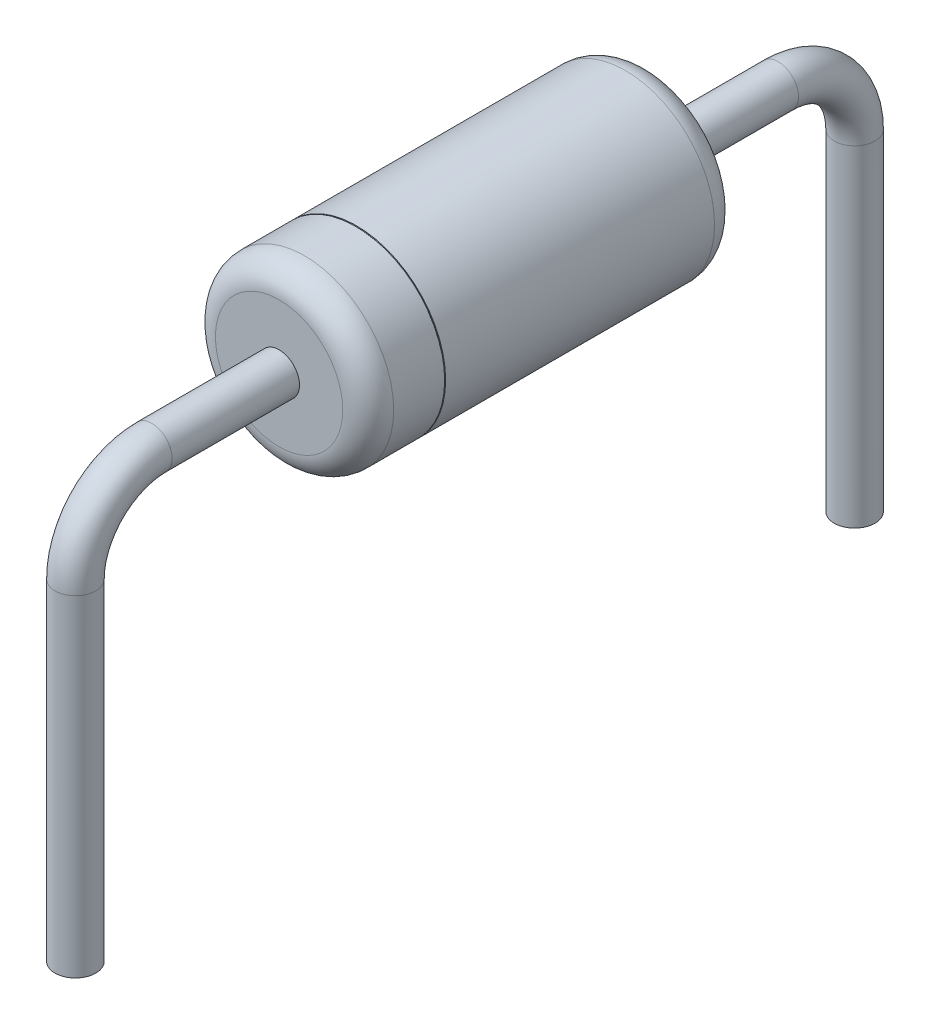
ISO-10303-21;
HEADER;
FILE_DESCRIPTION(('STEP AP214'),'2;1');
FILE_NAME('part.step','',(''),(''),'','','');
FILE_SCHEMA(('AUTOMOTIVE_DESIGN { 1 0 10303 214 1 1 1 1 }'));
ENDSEC;
DATA;
#1=APPLICATION_CONTEXT('core data for automotive mechanical design processes');
#2=APPLICATION_PROTOCOL_DEFINITION('international standard','automotive_design',2000,#1);
#3=PRODUCT_CONTEXT('',#1,'mechanical');
#4=PRODUCT('Part','Part','',(#3));
#5=PRODUCT_RELATED_PRODUCT_CATEGORY('part','',(#4));
#6=PRODUCT_DEFINITION_FORMATION('','',#4);
#7=PRODUCT_DEFINITION_CONTEXT('part definition',#1,'design');
#8=PRODUCT_DEFINITION('design','',#6,#7);
#9=PRODUCT_DEFINITION_SHAPE('','',#8);
#10=(LENGTH_UNIT() NAMED_UNIT(*) SI_UNIT(.MILLI.,.METRE.));
#11=(NAMED_UNIT(*) PLANE_ANGLE_UNIT() SI_UNIT($,.RADIAN.));
#12=(NAMED_UNIT(*) SI_UNIT($,.STERADIAN.) SOLID_ANGLE_UNIT());
#13=UNCERTAINTY_MEASURE_WITH_UNIT(LENGTH_MEASURE(1.E-05),#10,'distance_accuracy_value','');
#14=(GEOMETRIC_REPRESENTATION_CONTEXT(3) GLOBAL_UNCERTAINTY_ASSIGNED_CONTEXT((#13)) GLOBAL_UNIT_ASSIGNED_CONTEXT((#10,
#11,#12)) REPRESENTATION_CONTEXT('',''));
#15=CARTESIAN_POINT('',(0.,0.,0.));
#16=DIRECTION('',(0.,0.,1.));
#17=DIRECTION('',(1.,0.,0.));
#18=AXIS2_PLACEMENT_3D('',#15,#16,#17);
#19=CARTESIAN_POINT('',(0.,-4.,4.08));
#20=DIRECTION('',(0.,-1.,0.));
#21=DIRECTION('',(0.,0.,-1.));
#22=AXIS2_PLACEMENT_3D('',#19,#20,#21);
#23=PLANE('',#22);
#24=CARTESIAN_POINT('',(0.,-4.,4.08));
#25=DIRECTION('',(0.,-1.,0.));
#26=DIRECTION('',(0.,0.,-1.));
#27=AXIS2_PLACEMENT_3D('',#24,#25,#26);
#28=CIRCLE('',#27,0.2);
#29=CARTESIAN_POINT('',(0.,-4.,3.88));
#30=VERTEX_POINT('',#29);
#31=EDGE_CURVE('E93',#30,#30,#28,.T.);
#32=ORIENTED_EDGE('',*,*,#31,.T.);
#33=EDGE_LOOP('',(#32));
#34=FACE_BOUND('',#33,.T.);
#35=ADVANCED_FACE('F61',(#34),#23,.T.);
#36=CARTESIAN_POINT('',(0.,-4.,-3.57));
#37=DIRECTION('',(0.,1.,0.));
#38=DIRECTION('',(0.,0.,1.));
#39=AXIS2_PLACEMENT_3D('',#36,#37,#38);
#40=PLANE('',#39);
#41=CARTESIAN_POINT('',(0.,-4.,-3.57));
#42=DIRECTION('',(0.,1.,0.));
#43=DIRECTION('',(0.,0.,1.));
#44=AXIS2_PLACEMENT_3D('',#41,#42,#43);
#45=CIRCLE('',#44,0.2);
#46=CARTESIAN_POINT('',(0.,-4.,-3.37));
#47=VERTEX_POINT('',#46);
#48=EDGE_CURVE('E12',#47,#47,#45,.T.);
#49=ORIENTED_EDGE('',*,*,#48,.F.);
#50=EDGE_LOOP('',(#49));
#51=FACE_BOUND('',#50,.T.);
#52=ADVANCED_FACE('F101',(#51),#40,.F.);
#53=CARTESIAN_POINT('',(0.,-4.,4.08));
#54=DIRECTION('',(0.,1.,0.));
#55=DIRECTION('',(0.,0.,1.));
#56=AXIS2_PLACEMENT_3D('',#53,#54,#55);
#57=CYLINDRICAL_SURFACE('',#56,0.2);
#58=CARTESIAN_POINT('',(0.,-0.750000000000006,4.08));
#59=DIRECTION('',(0.,-1.,0.));
#60=DIRECTION('',(0.,0.,-1.));
#61=AXIS2_PLACEMENT_3D('',#58,#59,#60);
#62=CIRCLE('',#61,0.2);
#63=CARTESIAN_POINT('',(0.,-0.750000000000007,4.28));
#64=VERTEX_POINT('',#63);
#65=EDGE_CURVE('E89',#64,#64,#62,.T.);
#66=ORIENTED_EDGE('',*,*,#65,.T.);
#67=EDGE_LOOP('',(#66));
#68=FACE_BOUND('',#67,.T.);
#69=ORIENTED_EDGE('',*,*,#31,.F.);
#70=EDGE_LOOP('',(#69));
#71=FACE_BOUND('',#70,.T.);
#72=ADVANCED_FACE('F98',(#68,#71),#57,.T.);
#73=CARTESIAN_POINT('',(0.,-0.75,3.33));
#74=DIRECTION('',(-1.,0.,0.));
#75=DIRECTION('',(0.,0.,1.));
#76=AXIS2_PLACEMENT_3D('',#73,#74,#75);
#77=TOROIDAL_SURFACE('',#76,0.75,0.2);
#78=CARTESIAN_POINT('',(0.,0.,3.33));
#79=DIRECTION('',(0.,0.,1.));
#80=DIRECTION('',(0.,-1.,0.));
#81=AXIS2_PLACEMENT_3D('',#78,#79,#80);
#82=CIRCLE('',#81,0.2);
#83=CARTESIAN_POINT('',(0.,0.199999999999999,3.32999999999999));
#84=VERTEX_POINT('',#83);
#85=EDGE_CURVE('E85',#84,#84,#82,.T.);
#86=CARTESIAN_POINT('',(0.,-0.75,3.33));
#87=DIRECTION('',(-1.,0.,0.));
#88=DIRECTION('',(0.,0.,1.));
#89=AXIS2_PLACEMENT_3D('',#86,#87,#88);
#90=CIRCLE('',#89,0.95);
#91=EDGE_CURVE('',#64,#84,#90,.T.);
#92=ORIENTED_EDGE('',*,*,#65,.F.);
#93=ORIENTED_EDGE('',*,*,#85,.T.);
#94=ORIENTED_EDGE('',*,*,#91,.T.);
#95=ORIENTED_EDGE('',*,*,#91,.F.);
#96=EDGE_LOOP('',(#92,#94,#93,#95));
#97=FACE_BOUND('',#96,.T.);
#98=ADVANCED_FACE('F100',(#97),#77,.T.);
#99=CARTESIAN_POINT('',(0.,0.,3.32999999999999));
#100=DIRECTION('',(0.,0.,-1.));
#101=DIRECTION('',(0.,1.,0.));
#102=AXIS2_PLACEMENT_3D('',#99,#100,#101);
#103=CYLINDRICAL_SURFACE('',#102,0.2);
#104=CARTESIAN_POINT('',(0.,0.,0.));
#105=DIRECTION('',(0.,0.,1.));
#106=DIRECTION('',(0.,-1.,0.));
#107=AXIS2_PLACEMENT_3D('',#104,#105,#106);
#108=CIRCLE('',#107,0.2);
#109=CARTESIAN_POINT('',(0.,-0.2,0.));
#110=VERTEX_POINT('',#109);
#111=EDGE_CURVE('E80',#110,#110,#108,.T.);
#112=ORIENTED_EDGE('',*,*,#111,.T.);
#113=EDGE_LOOP('',(#112));
#114=FACE_BOUND('',#113,.T.);
#115=ORIENTED_EDGE('',*,*,#85,.F.);
#116=EDGE_LOOP('',(#115));
#117=FACE_BOUND('',#116,.T.);
#118=ADVANCED_FACE('F108',(#114,#117),#103,.T.);
#119=CARTESIAN_POINT('',(0.,0.,0.));
#120=DIRECTION('',(0.,0.,-1.));
#121=DIRECTION('',(-1.,0.,0.));
#122=AXIS2_PLACEMENT_3D('',#119,#120,#121);
#123=CYLINDRICAL_SURFACE('',#122,0.2);
#124=CARTESIAN_POINT('',(0.,0.,-2.81999999999999));
#125=DIRECTION('',(0.,0.,1.));
#126=DIRECTION('',(0.,-1.,0.));
#127=AXIS2_PLACEMENT_3D('',#124,#125,#126);
#128=CIRCLE('',#127,0.2);
#129=CARTESIAN_POINT('',(0.,0.2,-2.81999999999999));
#130=VERTEX_POINT('',#129);
#131=EDGE_CURVE('E75',#130,#130,#128,.T.);
#132=ORIENTED_EDGE('',*,*,#131,.T.);
#133=EDGE_LOOP('',(#132));
#134=FACE_BOUND('',#133,.T.);
#135=ORIENTED_EDGE('',*,*,#111,.F.);
#136=EDGE_LOOP('',(#135));
#137=FACE_BOUND('',#136,.T.);
#138=ADVANCED_FACE('F119',(#134,#137),#123,.T.);
#139=CARTESIAN_POINT('',(0.,-0.75,-2.82));
#140=DIRECTION('',(-1.,0.,0.));
#141=DIRECTION('',(0.,0.,1.));
#142=AXIS2_PLACEMENT_3D('',#139,#140,#141);
#143=TOROIDAL_SURFACE('',#142,0.75,0.2);
#144=CARTESIAN_POINT('',(0.,-0.749999999999999,-3.57));
#145=DIRECTION('',(0.,1.,0.));
#146=DIRECTION('',(0.,0.,1.));
#147=AXIS2_PLACEMENT_3D('',#144,#145,#146);
#148=CIRCLE('',#147,0.2);
#149=CARTESIAN_POINT('',(0.,-0.749999999999999,-3.77));
#150=VERTEX_POINT('',#149);
#151=EDGE_CURVE('E68',#150,#150,#148,.T.);
#152=CARTESIAN_POINT('',(0.,-0.75,-2.82));
#153=DIRECTION('',(-1.,0.,0.));
#154=DIRECTION('',(0.,0.,1.));
#155=AXIS2_PLACEMENT_3D('',#152,#153,#154);
#156=CIRCLE('',#155,0.95);
#157=EDGE_CURVE('',#130,#150,#156,.T.);
#158=ORIENTED_EDGE('',*,*,#131,.F.);
#159=ORIENTED_EDGE('',*,*,#151,.T.);
#160=ORIENTED_EDGE('',*,*,#157,.T.);
#161=ORIENTED_EDGE('',*,*,#157,.F.);
#162=EDGE_LOOP('',(#158,#160,#159,#161));
#163=FACE_BOUND('',#162,.T.);
#164=ADVANCED_FACE('F114',(#163),#143,.T.);
#165=CARTESIAN_POINT('',(0.,-0.750000000000005,-3.57));
#166=DIRECTION('',(0.,-1.,0.));
#167=DIRECTION('',(0.,0.,-1.));
#168=AXIS2_PLACEMENT_3D('',#165,#166,#167);
#169=CYLINDRICAL_SURFACE('',#168,0.2);
#170=ORIENTED_EDGE('',*,*,#48,.T.);
#171=EDGE_LOOP('',(#170));
#172=FACE_BOUND('',#171,.T.);
#173=ORIENTED_EDGE('',*,*,#151,.F.);
#174=EDGE_LOOP('',(#173));
#175=FACE_BOUND('',#174,.T.);
#176=ADVANCED_FACE('F112',(#172,#175),#169,.T.);
#177=CLOSED_SHELL('',(#35,#52,#72,#98,#118,#138,#164,#176));
#178=MANIFOLD_SOLID_BREP('B2',#177);
#179=CARTESIAN_POINT('',(0.,0.625,-1.57));
#180=DIRECTION('',(0.,0.,1.));
#181=DIRECTION('',(1.,0.,0.));
#182=AXIS2_PLACEMENT_3D('',#179,#180,#181);
#183=PLANE('',#182);
#184=CARTESIAN_POINT('',(0.,0.,-1.57));
#185=DIRECTION('',(0.,0.,1.));
#186=DIRECTION('',(1.,0.,0.));
#187=AXIS2_PLACEMENT_3D('',#184,#185,#186);
#188=CIRCLE('',#187,0.625);
#189=CARTESIAN_POINT('',(0.625,0.,-1.57));
#190=VERTEX_POINT('',#189);
#191=EDGE_CURVE('E60',#190,#190,#188,.T.);
#192=ORIENTED_EDGE('',*,*,#191,.F.);
#193=EDGE_LOOP('',(#192));
#194=FACE_BOUND('',#193,.T.);
#195=ADVANCED_FACE('F208',(#194),#183,.F.);
#196=CARTESIAN_POINT('',(0.,0.,-1.32));
#197=DIRECTION('',(0.,0.,1.));
#198=DIRECTION('',(1.,0.,0.));
#199=AXIS2_PLACEMENT_3D('',#196,#197,#198);
#200=TOROIDAL_SURFACE('',#199,0.625,0.25);
#201=CARTESIAN_POINT('',(0.,0.,-1.32));
#202=DIRECTION('',(0.,0.,1.));
#203=DIRECTION('',(1.,0.,0.));
#204=AXIS2_PLACEMENT_3D('',#201,#202,#203);
#205=CIRCLE('',#204,0.875);
#206=CARTESIAN_POINT('',(0.875,0.,-1.32));
#207=VERTEX_POINT('',#206);
#208=EDGE_CURVE('E215',#207,#207,#205,.T.);
#209=ORIENTED_EDGE('',*,*,#208,.F.);
#210=EDGE_LOOP('',(#209));
#211=FACE_BOUND('',#210,.T.);
#212=ORIENTED_EDGE('',*,*,#191,.T.);
#213=EDGE_LOOP('',(#212));
#214=FACE_BOUND('',#213,.T.);
#215=ADVANCED_FACE('F282',(#211,#214),#200,.T.);
#216=CARTESIAN_POINT('',(0.,0.,2.08));
#217=DIRECTION('',(0.,0.,1.));
#218=DIRECTION('',(1.,0.,0.));
#219=AXIS2_PLACEMENT_3D('',#216,#217,#218);
#220=CYLINDRICAL_SURFACE('',#219,0.875);
#221=CARTESIAN_POINT('',(0.,0.,1.32));
#222=DIRECTION('',(0.,0.,1.));
#223=DIRECTION('',(1.,0.,0.));
#224=AXIS2_PLACEMENT_3D('',#221,#222,#223);
#225=CIRCLE('',#224,0.875);
#226=CARTESIAN_POINT('',(0.875,0.,1.32));
#227=VERTEX_POINT('',#226);
#228=EDGE_CURVE('E222',#227,#227,#225,.T.);
#229=ORIENTED_EDGE('',*,*,#228,.F.);
#230=EDGE_LOOP('',(#229));
#231=FACE_BOUND('',#230,.T.);
#232=ORIENTED_EDGE('',*,*,#208,.T.);
#233=EDGE_LOOP('',(#232));
#234=FACE_BOUND('',#233,.T.);
#235=ADVANCED_FACE('F277',(#231,#234),#220,.T.);
#236=CARTESIAN_POINT('',(0.,0.875,1.32));
#237=DIRECTION('',(0.,0.,-1.));
#238=DIRECTION('',(-1.,0.,0.));
#239=AXIS2_PLACEMENT_3D('',#236,#237,#238);
#240=PLANE('',#239);
#241=CARTESIAN_POINT('',(0.,0.,1.32));
#242=DIRECTION('',(0.,0.,1.));
#243=DIRECTION('',(1.,0.,0.));
#244=AXIS2_PLACEMENT_3D('',#241,#242,#243);
#245=CIRCLE('',#244,0.865);
#246=CARTESIAN_POINT('',(0.865,0.,1.32));
#247=VERTEX_POINT('',#246);
#248=EDGE_CURVE('E229',#247,#247,#245,.T.);
#249=ORIENTED_EDGE('',*,*,#248,.F.);
#250=EDGE_LOOP('',(#249));
#251=FACE_BOUND('',#250,.T.);
#252=ORIENTED_EDGE('',*,*,#228,.T.);
#253=EDGE_LOOP('',(#252));
#254=FACE_BOUND('',#253,.T.);
#255=ADVANCED_FACE('F271',(#251,#254),#240,.F.);
#256=CARTESIAN_POINT('',(0.,0.,2.08));
#257=DIRECTION('',(0.,0.,1.));
#258=DIRECTION('',(1.,0.,0.));
#259=AXIS2_PLACEMENT_3D('',#256,#257,#258);
#260=CYLINDRICAL_SURFACE('',#259,0.865);
#261=CARTESIAN_POINT('',(0.,0.,1.33));
#262=DIRECTION('',(0.,0.,1.));
#263=DIRECTION('',(1.,0.,0.));
#264=AXIS2_PLACEMENT_3D('',#261,#262,#263);
#265=CIRCLE('',#264,0.865);
#266=CARTESIAN_POINT('',(0.865,0.,1.33));
#267=VERTEX_POINT('',#266);
#268=EDGE_CURVE('E234',#267,#267,#265,.T.);
#269=ORIENTED_EDGE('',*,*,#268,.F.);
#270=EDGE_LOOP('',(#269));
#271=FACE_BOUND('',#270,.T.);
#272=ORIENTED_EDGE('',*,*,#248,.T.);
#273=EDGE_LOOP('',(#272));
#274=FACE_BOUND('',#273,.T.);
#275=ADVANCED_FACE('F265',(#271,#274),#260,.T.);
#276=CARTESIAN_POINT('',(0.,0.875,1.33));
#277=DIRECTION('',(0.,0.,1.));
#278=DIRECTION('',(1.,0.,0.));
#279=AXIS2_PLACEMENT_3D('',#276,#277,#278);
#280=PLANE('',#279);
#281=CARTESIAN_POINT('',(0.,0.,1.33));
#282=DIRECTION('',(0.,0.,1.));
#283=DIRECTION('',(1.,0.,0.));
#284=AXIS2_PLACEMENT_3D('',#281,#282,#283);
#285=CIRCLE('',#284,0.875);
#286=CARTESIAN_POINT('',(0.875,0.,1.33));
#287=VERTEX_POINT('',#286);
#288=EDGE_CURVE('E237',#287,#287,#285,.T.);
#289=ORIENTED_EDGE('',*,*,#288,.F.);
#290=EDGE_LOOP('',(#289));
#291=FACE_BOUND('',#290,.T.);
#292=ORIENTED_EDGE('',*,*,#268,.T.);
#293=EDGE_LOOP('',(#292));
#294=FACE_BOUND('',#293,.T.);
#295=ADVANCED_FACE('F259',(#291,#294),#280,.F.);
#296=CARTESIAN_POINT('',(0.,0.,2.08));
#297=DIRECTION('',(0.,0.,1.));
#298=DIRECTION('',(1.,0.,0.));
#299=AXIS2_PLACEMENT_3D('',#296,#297,#298);
#300=CYLINDRICAL_SURFACE('',#299,0.875);
#301=CARTESIAN_POINT('',(0.,0.,1.83));
#302=DIRECTION('',(0.,0.,1.));
#303=DIRECTION('',(1.,0.,0.));
#304=AXIS2_PLACEMENT_3D('',#301,#302,#303);
#305=CIRCLE('',#304,0.875);
#306=CARTESIAN_POINT('',(0.875,0.,1.83));
#307=VERTEX_POINT('',#306);
#308=EDGE_CURVE('E240',#307,#307,#305,.T.);
#309=ORIENTED_EDGE('',*,*,#308,.F.);
#310=EDGE_LOOP('',(#309));
#311=FACE_BOUND('',#310,.T.);
#312=ORIENTED_EDGE('',*,*,#288,.T.);
#313=EDGE_LOOP('',(#312));
#314=FACE_BOUND('',#313,.T.);
#315=ADVANCED_FACE('F253',(#311,#314),#300,.T.);
#316=CARTESIAN_POINT('',(0.,0.,1.83));
#317=DIRECTION('',(0.,0.,1.));
#318=DIRECTION('',(1.,0.,0.));
#319=AXIS2_PLACEMENT_3D('',#316,#317,#318);
#320=TOROIDAL_SURFACE('',#319,0.625,0.25);
#321=CARTESIAN_POINT('',(0.,0.,2.08));
#322=DIRECTION('',(0.,0.,1.));
#323=DIRECTION('',(1.,0.,0.));
#324=AXIS2_PLACEMENT_3D('',#321,#322,#323);
#325=CIRCLE('',#324,0.625);
#326=CARTESIAN_POINT('',(0.625,0.,2.08));
#327=VERTEX_POINT('',#326);
#328=EDGE_CURVE('E243',#327,#327,#325,.T.);
#329=ORIENTED_EDGE('',*,*,#328,.F.);
#330=EDGE_LOOP('',(#329));
#331=FACE_BOUND('',#330,.T.);
#332=ORIENTED_EDGE('',*,*,#308,.T.);
#333=EDGE_LOOP('',(#332));
#334=FACE_BOUND('',#333,.T.);
#335=ADVANCED_FACE('F250',(#331,#334),#320,.T.);
#336=CARTESIAN_POINT('',(0.,0.625,2.08));
#337=DIRECTION('',(0.,0.,-1.));
#338=DIRECTION('',(-1.,0.,0.));
#339=AXIS2_PLACEMENT_3D('',#336,#337,#338);
#340=PLANE('',#339);
#341=ORIENTED_EDGE('',*,*,#328,.T.);
#342=EDGE_LOOP('',(#341));
#343=FACE_BOUND('',#342,.T.);
#344=ADVANCED_FACE('F248',(#343),#340,.F.);
#345=CLOSED_SHELL('',(#195,#215,#235,#255,#275,#295,#315,#335,#344));
#346=MANIFOLD_SOLID_BREP('B7',#345);
#347=ADVANCED_BREP_SHAPE_REPRESENTATION('',(#18,#178,#346),#14);
#348=SHAPE_DEFINITION_REPRESENTATION(#9,#347);
ENDSEC;
END-ISO-10303-21;
